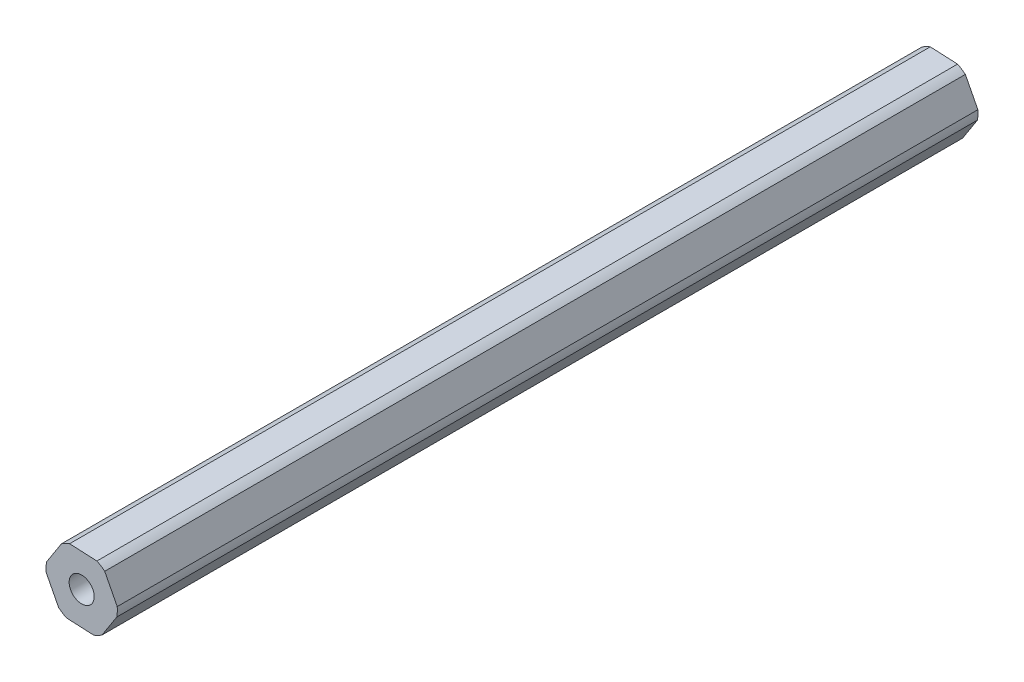
ISO-10303-21;
HEADER;
FILE_DESCRIPTION(('STEP AP214'),'2;1');
FILE_NAME('part.step','',(''),(''),'','','');
FILE_SCHEMA(('AUTOMOTIVE_DESIGN { 1 0 10303 214 1 1 1 1 }'));
ENDSEC;
DATA;
#1=APPLICATION_CONTEXT('core data for automotive mechanical design processes');
#2=APPLICATION_PROTOCOL_DEFINITION('international standard','automotive_design',2000,#1);
#3=PRODUCT_CONTEXT('',#1,'mechanical');
#4=PRODUCT('Part','Part','',(#3));
#5=PRODUCT_RELATED_PRODUCT_CATEGORY('part','',(#4));
#6=PRODUCT_DEFINITION_FORMATION('','',#4);
#7=PRODUCT_DEFINITION_CONTEXT('part definition',#1,'design');
#8=PRODUCT_DEFINITION('design','',#6,#7);
#9=PRODUCT_DEFINITION_SHAPE('','',#8);
#10=(LENGTH_UNIT() NAMED_UNIT(*) SI_UNIT(.MILLI.,.METRE.));
#11=(NAMED_UNIT(*) PLANE_ANGLE_UNIT() SI_UNIT($,.RADIAN.));
#12=(NAMED_UNIT(*) SI_UNIT($,.STERADIAN.) SOLID_ANGLE_UNIT());
#13=UNCERTAINTY_MEASURE_WITH_UNIT(LENGTH_MEASURE(1.E-05),#10,'distance_accuracy_value','');
#14=(GEOMETRIC_REPRESENTATION_CONTEXT(3) GLOBAL_UNCERTAINTY_ASSIGNED_CONTEXT((#13)) GLOBAL_UNIT_ASSIGNED_CONTEXT((#10,
#11,#12)) REPRESENTATION_CONTEXT('',''));
#15=CARTESIAN_POINT('',(0.,0.,0.));
#16=DIRECTION('',(0.,0.,1.));
#17=DIRECTION('',(1.,0.,0.));
#18=AXIS2_PLACEMENT_3D('',#15,#16,#17);
#19=CARTESIAN_POINT('',(-25.4,-1.E-12,-142.8115));
#20=DIRECTION('',(0.,0.,1.));
#21=DIRECTION('',(1.,0.,0.));
#22=AXIS2_PLACEMENT_3D('',#19,#20,#21);
#23=PLANE('',#22);
#24=CARTESIAN_POINT('',(-25.4,-1.E-12,-142.8115));
#25=DIRECTION('',(0.,0.,-1.));
#26=DIRECTION('',(-1.,0.,0.));
#27=AXIS2_PLACEMENT_3D('',#24,#25,#26);
#28=CIRCLE('',#27,2.413);
#29=CARTESIAN_POINT('',(-27.813,-1.E-12,-142.8115));
#30=VERTEX_POINT('',#29);
#31=EDGE_CURVE('E179',#30,#30,#28,.T.);
#32=ORIENTED_EDGE('',*,*,#31,.F.);
#33=EDGE_LOOP('',(#32));
#34=FACE_BOUND('',#33,.T.);
#35=CARTESIAN_POINT('',(-25.4,-1.E-12,-142.8115));
#36=DIRECTION('',(0.,0.,1.));
#37=DIRECTION('',(1.,0.,0.));
#38=AXIS2_PLACEMENT_3D('',#35,#36,#37);
#39=CIRCLE('',#38,6.875);
#40=CARTESIAN_POINT('',(-18.6339036084313,-1.21883740507216,-142.8115));
#41=VERTEX_POINT('',#40);
#42=CARTESIAN_POINT('',(-18.5482711692134,0.565187605460523,-142.8115));
#43=VERTEX_POINT('',#42);
#44=EDGE_CURVE('E164',#41,#43,#39,.T.);
#45=ORIENTED_EDGE('',*,*,#44,.F.);
#46=DIRECTION('',(0.540946049578257,0.841057293794946,0.));
#47=VECTOR('',#46,1.);
#48=CARTESIAN_POINT('',(-21.4846687603729,-5.65117742457372,-142.8115));
#49=LINE('',#48,#47);
#50=CARTESIAN_POINT('',(-21.4846687603729,-5.65117742457372,-142.8115));
#51=VERTEX_POINT('',#50);
#52=EDGE_CURVE('E217',#51,#41,#49,.T.);
#53=ORIENTED_EDGE('',*,*,#52,.F.);
#54=CARTESIAN_POINT('',(-25.4,-1.E-12,-142.8115));
#55=DIRECTION('',(0.,0.,1.));
#56=DIRECTION('',(1.,0.,0.));
#57=AXIS2_PLACEMENT_3D('',#54,#55,#56);
#58=CIRCLE('',#57,6.875);
#59=CARTESIAN_POINT('',(-23.0724959600899,-6.46903006208932,-142.8115));
#60=VERTEX_POINT('',#59);
#61=EDGE_CURVE('E213',#60,#51,#58,.T.);
#62=ORIENTED_EDGE('',*,*,#61,.F.);
#63=DIRECTION('',(0.998850007253744,-0.0479443741141371,0.));
#64=VECTOR('',#63,1.);
#65=CARTESIAN_POINT('',(-28.3363975911596,-6.21636503003521,-142.8115));
#66=LINE('',#65,#64);
#67=CARTESIAN_POINT('',(-28.3363975911596,-6.21636503003521,-142.8115));
#68=VERTEX_POINT('',#67);
#69=EDGE_CURVE('E209',#68,#60,#66,.T.);
#70=ORIENTED_EDGE('',*,*,#69,.F.);
#71=CARTESIAN_POINT('',(-25.4,-1.E-12,-142.8115));
#72=DIRECTION('',(0.,0.,1.));
#73=DIRECTION('',(1.,0.,0.));
#74=AXIS2_PLACEMENT_3D('',#71,#72,#73);
#75=CIRCLE('',#74,6.87499999999998);
#76=CARTESIAN_POINT('',(-29.8385923516587,-5.25019265701812,-142.8115));
#77=VERTEX_POINT('',#76);
#78=EDGE_CURVE('E205',#77,#68,#75,.T.);
#79=ORIENTED_EDGE('',*,*,#78,.F.);
#80=DIRECTION('',(0.457903957675487,-0.88900166790908,0.));
#81=VECTOR('',#80,1.);
#82=CARTESIAN_POINT('',(-32.2517288307866,-0.565187605462549,-142.8115));
#83=LINE('',#82,#81);
#84=CARTESIAN_POINT('',(-32.2517288307866,-0.565187605462549,-142.8115));
#85=VERTEX_POINT('',#84);
#86=EDGE_CURVE('E201',#85,#77,#83,.T.);
#87=ORIENTED_EDGE('',*,*,#86,.F.);
#88=CARTESIAN_POINT('',(-25.4,-1.E-12,-142.8115));
#89=DIRECTION('',(0.,0.,1.));
#90=DIRECTION('',(1.,0.,0.));
#91=AXIS2_PLACEMENT_3D('',#88,#89,#90);
#92=CIRCLE('',#91,6.87499999999999);
#93=CARTESIAN_POINT('',(-32.1660963915687,1.2188374050702,-142.8115));
#94=VERTEX_POINT('',#93);
#95=EDGE_CURVE('E197',#94,#85,#92,.T.);
#96=ORIENTED_EDGE('',*,*,#95,.F.);
#97=DIRECTION('',(-0.540946049578256,-0.841057293794946,0.));
#98=VECTOR('',#97,1.);
#99=CARTESIAN_POINT('',(-29.3153312396271,5.65117742457169,-142.8115));
#100=LINE('',#99,#98);
#101=CARTESIAN_POINT('',(-29.3153312396271,5.65117742457169,-142.8115));
#102=VERTEX_POINT('',#101);
#103=EDGE_CURVE('E193',#102,#94,#100,.T.);
#104=ORIENTED_EDGE('',*,*,#103,.F.);
#105=CARTESIAN_POINT('',(-25.4,-1.E-12,-142.8115));
#106=DIRECTION('',(0.,0.,1.));
#107=DIRECTION('',(1.,0.,0.));
#108=AXIS2_PLACEMENT_3D('',#105,#106,#107);
#109=CIRCLE('',#108,6.875);
#110=CARTESIAN_POINT('',(-27.72750403991,6.46903006208734,-142.8115));
#111=VERTEX_POINT('',#110);
#112=EDGE_CURVE('E189',#111,#102,#109,.T.);
#113=ORIENTED_EDGE('',*,*,#112,.F.);
#114=DIRECTION('',(-0.998850007253744,0.0479443741141365,0.));
#115=VECTOR('',#114,1.);
#116=CARTESIAN_POINT('',(-22.4636024088405,6.21636503003323,-142.8115));
#117=LINE('',#116,#115);
#118=CARTESIAN_POINT('',(-22.4636024088405,6.21636503003323,-142.8115));
#119=VERTEX_POINT('',#118);
#120=EDGE_CURVE('E185',#119,#111,#117,.T.);
#121=ORIENTED_EDGE('',*,*,#120,.F.);
#122=CARTESIAN_POINT('',(-25.4,-1.E-12,-142.8115));
#123=DIRECTION('',(0.,0.,1.));
#124=DIRECTION('',(1.,0.,0.));
#125=AXIS2_PLACEMENT_3D('',#122,#123,#124);
#126=CIRCLE('',#125,6.875);
#127=CARTESIAN_POINT('',(-20.9614076483413,5.25019265701615,-142.8115));
#128=VERTEX_POINT('',#127);
#129=EDGE_CURVE('E168',#128,#119,#126,.T.);
#130=ORIENTED_EDGE('',*,*,#129,.F.);
#131=DIRECTION('',(-0.457903957675487,0.88900166790908,0.));
#132=VECTOR('',#131,1.);
#133=CARTESIAN_POINT('',(-18.5482711692134,0.565187605460523,-142.8115));
#134=LINE('',#133,#132);
#135=EDGE_CURVE('E152',#43,#128,#134,.T.);
#136=ORIENTED_EDGE('',*,*,#135,.F.);
#137=EDGE_LOOP('',(#45,#53,#62,#70,#79,#87,#96,#104,#113,#121,#130,#136));
#138=FACE_BOUND('',#137,.T.);
#139=ADVANCED_FACE('F57',(#34,#138),#23,.F.);
#140=CARTESIAN_POINT('',(-25.4,-1.E-12,72.4535000000722));
#141=DIRECTION('',(0.,0.,-1.));
#142=DIRECTION('',(-0.457903957675486,0.88900166790908,0.));
#143=AXIS2_PLACEMENT_3D('',#140,#141,#142);
#144=CYLINDRICAL_SURFACE('',#143,6.875);
#145=CARTESIAN_POINT('',(-25.4,-1.E-12,23.0505));
#146=DIRECTION('',(0.,0.,-1.));
#147=DIRECTION('',(-1.,0.,0.));
#148=AXIS2_PLACEMENT_3D('',#145,#146,#147);
#149=CIRCLE('',#148,6.875);
#150=CARTESIAN_POINT('',(-20.9614076483413,5.25019265701615,23.0505));
#151=VERTEX_POINT('',#150);
#152=CARTESIAN_POINT('',(-22.4636024088405,6.21636503003324,23.0505));
#153=VERTEX_POINT('',#152);
#154=EDGE_CURVE('E238',#151,#153,#149,.F.);
#155=ORIENTED_EDGE('',*,*,#154,.F.);
#156=DIRECTION('',(0.,0.,-1.));
#157=VECTOR('',#156,1.);
#158=CARTESIAN_POINT('',(-20.9614076483413,5.25019265701615,72.4535000000722));
#159=LINE('',#158,#157);
#160=EDGE_CURVE('E158',#151,#128,#159,.T.);
#161=ORIENTED_EDGE('',*,*,#160,.T.);
#162=ORIENTED_EDGE('',*,*,#129,.T.);
#163=DIRECTION('',(0.,0.,1.));
#164=VECTOR('',#163,1.);
#165=CARTESIAN_POINT('',(-22.4636024088405,6.21636503003324,72.4535000000722));
#166=LINE('',#165,#164);
#167=EDGE_CURVE('E277',#119,#153,#166,.T.);
#168=ORIENTED_EDGE('',*,*,#167,.T.);
#169=EDGE_LOOP('',(#155,#161,#162,#168));
#170=FACE_BOUND('',#169,.T.);
#171=ADVANCED_FACE('F514',(#170),#144,.T.);
#172=CARTESIAN_POINT('',(-25.4,-1.E-12,72.4535000000722));
#173=DIRECTION('',(0.,0.,-1.));
#174=DIRECTION('',(-0.457903957675486,0.88900166790908,0.));
#175=AXIS2_PLACEMENT_3D('',#172,#173,#174);
#176=CYLINDRICAL_SURFACE('',#175,6.875);
#177=CARTESIAN_POINT('',(-25.4,-1.E-12,23.0505));
#178=DIRECTION('',(0.,0.,-1.));
#179=DIRECTION('',(-1.,0.,0.));
#180=AXIS2_PLACEMENT_3D('',#177,#178,#179);
#181=CIRCLE('',#180,6.875);
#182=CARTESIAN_POINT('',(-18.6339036084313,-1.21883740507216,23.0505));
#183=VERTEX_POINT('',#182);
#184=CARTESIAN_POINT('',(-18.5482711692134,0.565187605460525,23.0505));
#185=VERTEX_POINT('',#184);
#186=EDGE_CURVE('E249',#183,#185,#181,.F.);
#187=ORIENTED_EDGE('',*,*,#186,.F.);
#188=DIRECTION('',(0.,0.,-1.));
#189=VECTOR('',#188,1.);
#190=CARTESIAN_POINT('',(-18.6339036084313,-1.21883740507216,72.4535000000722));
#191=LINE('',#190,#189);
#192=EDGE_CURVE('E173',#183,#41,#191,.T.);
#193=ORIENTED_EDGE('',*,*,#192,.T.);
#194=ORIENTED_EDGE('',*,*,#44,.T.);
#195=DIRECTION('',(0.,0.,1.));
#196=VECTOR('',#195,1.);
#197=CARTESIAN_POINT('',(-18.5482711692134,0.565187605460524,72.4535000000722));
#198=LINE('',#197,#196);
#199=EDGE_CURVE('E148',#43,#185,#198,.T.);
#200=ORIENTED_EDGE('',*,*,#199,.T.);
#201=EDGE_LOOP('',(#187,#193,#194,#200));
#202=FACE_BOUND('',#201,.T.);
#203=ADVANCED_FACE('F171',(#202),#176,.T.);
#204=CARTESIAN_POINT('',(-25.4,-1.E-12,72.4535000000722));
#205=DIRECTION('',(0.,0.,-1.));
#206=DIRECTION('',(-0.457903957675486,0.88900166790908,0.));
#207=AXIS2_PLACEMENT_3D('',#204,#205,#206);
#208=CYLINDRICAL_SURFACE('',#207,6.875);
#209=CARTESIAN_POINT('',(-25.4,-1.E-12,23.0505));
#210=DIRECTION('',(0.,0.,-1.));
#211=DIRECTION('',(-1.,0.,0.));
#212=AXIS2_PLACEMENT_3D('',#209,#210,#211);
#213=CIRCLE('',#212,6.875);
#214=CARTESIAN_POINT('',(-32.1660963915687,1.2188374050702,23.0505));
#215=VERTEX_POINT('',#214);
#216=CARTESIAN_POINT('',(-32.2517288307866,-0.565187605462551,23.0505));
#217=VERTEX_POINT('',#216);
#218=EDGE_CURVE('E224',#215,#217,#213,.F.);
#219=ORIENTED_EDGE('',*,*,#218,.F.);
#220=DIRECTION('',(0.,0.,-1.));
#221=VECTOR('',#220,1.);
#222=CARTESIAN_POINT('',(-32.1660963915687,1.2188374050702,72.4535000000722));
#223=LINE('',#222,#221);
#224=EDGE_CURVE('E157',#215,#94,#223,.T.);
#225=ORIENTED_EDGE('',*,*,#224,.T.);
#226=ORIENTED_EDGE('',*,*,#95,.T.);
#227=DIRECTION('',(0.,0.,1.));
#228=VECTOR('',#227,1.);
#229=CARTESIAN_POINT('',(-32.2517288307866,-0.565187605462551,72.4535000000722));
#230=LINE('',#229,#228);
#231=EDGE_CURVE('E261',#85,#217,#230,.T.);
#232=ORIENTED_EDGE('',*,*,#231,.T.);
#233=EDGE_LOOP('',(#219,#225,#226,#232));
#234=FACE_BOUND('',#233,.T.);
#235=ADVANCED_FACE('F59',(#234),#208,.T.);
#236=CARTESIAN_POINT('',(-25.4,-1.E-12,72.4535000000722));
#237=DIRECTION('',(0.,0.,-1.));
#238=DIRECTION('',(-0.457903957675486,0.88900166790908,0.));
#239=AXIS2_PLACEMENT_3D('',#236,#237,#238);
#240=CYLINDRICAL_SURFACE('',#239,6.875);
#241=CARTESIAN_POINT('',(-25.4,-1.E-12,23.0505));
#242=DIRECTION('',(0.,0.,-1.));
#243=DIRECTION('',(-1.,0.,0.));
#244=AXIS2_PLACEMENT_3D('',#241,#242,#243);
#245=CIRCLE('',#244,6.875);
#246=CARTESIAN_POINT('',(-23.0724959600899,-6.46903006208932,23.0505));
#247=VERTEX_POINT('',#246);
#248=CARTESIAN_POINT('',(-21.4846687603729,-5.65117742457372,23.0505));
#249=VERTEX_POINT('',#248);
#250=EDGE_CURVE('E81',#247,#249,#245,.F.);
#251=ORIENTED_EDGE('',*,*,#250,.F.);
#252=DIRECTION('',(0.,0.,-1.));
#253=VECTOR('',#252,1.);
#254=CARTESIAN_POINT('',(-23.0724959600899,-6.46903006208932,72.4535000000722));
#255=LINE('',#254,#253);
#256=EDGE_CURVE('E61',#247,#60,#255,.T.);
#257=ORIENTED_EDGE('',*,*,#256,.T.);
#258=ORIENTED_EDGE('',*,*,#61,.T.);
#259=DIRECTION('',(0.,0.,1.));
#260=VECTOR('',#259,1.);
#261=CARTESIAN_POINT('',(-21.4846687603729,-5.65117742457372,72.4535000000722));
#262=LINE('',#261,#260);
#263=EDGE_CURVE('E262',#51,#249,#262,.T.);
#264=ORIENTED_EDGE('',*,*,#263,.T.);
#265=EDGE_LOOP('',(#251,#257,#258,#264));
#266=FACE_BOUND('',#265,.T.);
#267=ADVANCED_FACE('F365',(#266),#240,.T.);
#268=CARTESIAN_POINT('',(-25.4,-1.E-12,72.4535000000722));
#269=DIRECTION('',(0.,0.,-1.));
#270=DIRECTION('',(-0.457903957675486,0.88900166790908,0.));
#271=AXIS2_PLACEMENT_3D('',#268,#269,#270);
#272=CYLINDRICAL_SURFACE('',#271,6.875);
#273=CARTESIAN_POINT('',(-25.4,-1.E-12,23.0505));
#274=DIRECTION('',(0.,0.,-1.));
#275=DIRECTION('',(-1.,0.,0.));
#276=AXIS2_PLACEMENT_3D('',#273,#274,#275);
#277=CIRCLE('',#276,6.875);
#278=CARTESIAN_POINT('',(-29.8385923516587,-5.25019265701812,23.0505));
#279=VERTEX_POINT('',#278);
#280=CARTESIAN_POINT('',(-28.3363975911596,-6.21636503003522,23.0505));
#281=VERTEX_POINT('',#280);
#282=EDGE_CURVE('E235',#279,#281,#277,.F.);
#283=ORIENTED_EDGE('',*,*,#282,.F.);
#284=DIRECTION('',(0.,0.,-1.));
#285=VECTOR('',#284,1.);
#286=CARTESIAN_POINT('',(-29.8385923516587,-5.25019265701812,72.4535000000722));
#287=LINE('',#286,#285);
#288=EDGE_CURVE('E258',#279,#77,#287,.T.);
#289=ORIENTED_EDGE('',*,*,#288,.T.);
#290=ORIENTED_EDGE('',*,*,#78,.T.);
#291=DIRECTION('',(0.,0.,1.));
#292=VECTOR('',#291,1.);
#293=CARTESIAN_POINT('',(-28.3363975911596,-6.21636503003522,72.4535000000722));
#294=LINE('',#293,#292);
#295=EDGE_CURVE('E68',#68,#281,#294,.T.);
#296=ORIENTED_EDGE('',*,*,#295,.T.);
#297=EDGE_LOOP('',(#283,#289,#290,#296));
#298=FACE_BOUND('',#297,.T.);
#299=ADVANCED_FACE('F472',(#298),#272,.T.);
#300=CARTESIAN_POINT('',(-22.0424886400179,-6.51846997392313,-103.1875));
#301=DIRECTION('',(0.0479443741141347,0.998850007253744,0.));
#302=DIRECTION('',(0.,0.,1.));
#303=AXIS2_PLACEMENT_3D('',#300,#301,#302);
#304=PLANE('',#303);
#305=ORIENTED_EDGE('',*,*,#295,.F.);
#306=ORIENTED_EDGE('',*,*,#69,.T.);
#307=ORIENTED_EDGE('',*,*,#256,.F.);
#308=DIRECTION('',(-0.998850007253744,0.0479443741141346,0.));
#309=VECTOR('',#308,1.);
#310=CARTESIAN_POINT('',(-22.0424886400179,-6.51846997392313,23.0505));
#311=LINE('',#310,#309);
#312=EDGE_CURVE('E243',#247,#281,#311,.T.);
#313=ORIENTED_EDGE('',*,*,#312,.T.);
#314=EDGE_LOOP('',(#305,#306,#307,#313));
#315=FACE_BOUND('',#314,.T.);
#316=ADVANCED_FACE('F373',(#315),#304,.F.);
#317=CARTESIAN_POINT('',(-29.3664049112316,-6.16692511820139,-103.1875));
#318=DIRECTION('',(0.889001667909081,0.457903957675486,0.));
#319=DIRECTION('',(-0.457903957675486,0.889001667909081,0.));
#320=AXIS2_PLACEMENT_3D('',#317,#318,#319);
#321=PLANE('',#320);
#322=ORIENTED_EDGE('',*,*,#288,.F.);
#323=DIRECTION('',(-0.457903957675486,0.88900166790908,0.));
#324=VECTOR('',#323,1.);
#325=CARTESIAN_POINT('',(-29.3664049112316,-6.16692511820139,23.0505));
#326=LINE('',#325,#324);
#327=EDGE_CURVE('E231',#279,#217,#326,.T.);
#328=ORIENTED_EDGE('',*,*,#327,.T.);
#329=ORIENTED_EDGE('',*,*,#231,.F.);
#330=ORIENTED_EDGE('',*,*,#86,.T.);
#331=EDGE_LOOP('',(#322,#328,#329,#330));
#332=FACE_BOUND('',#331,.T.);
#333=ADVANCED_FACE('F450',(#332),#321,.F.);
#334=CARTESIAN_POINT('',(-18.0760837287863,-0.35154485572273,-103.1875));
#335=DIRECTION('',(-0.841057293794946,0.540946049578258,0.));
#336=DIRECTION('',(0.,0.,1.));
#337=AXIS2_PLACEMENT_3D('',#334,#335,#336);
#338=PLANE('',#337);
#339=ORIENTED_EDGE('',*,*,#263,.F.);
#340=ORIENTED_EDGE('',*,*,#52,.T.);
#341=ORIENTED_EDGE('',*,*,#192,.F.);
#342=DIRECTION('',(-0.540946049578258,-0.841057293794945,0.));
#343=VECTOR('',#342,1.);
#344=CARTESIAN_POINT('',(-18.0760837287863,-0.35154485572273,23.0505));
#345=LINE('',#344,#343);
#346=EDGE_CURVE('E76',#183,#249,#345,.T.);
#347=ORIENTED_EDGE('',*,*,#346,.T.);
#348=EDGE_LOOP('',(#339,#340,#341,#347));
#349=FACE_BOUND('',#348,.T.);
#350=ADVANCED_FACE('F369',(#349),#338,.F.);
#351=CARTESIAN_POINT('',(-32.7239162712137,0.351544855720738,-103.1875));
#352=DIRECTION('',(0.841057293794946,-0.540946049578258,0.));
#353=DIRECTION('',(0.,0.,-1.));
#354=AXIS2_PLACEMENT_3D('',#351,#352,#353);
#355=PLANE('',#354);
#356=ORIENTED_EDGE('',*,*,#224,.F.);
#357=DIRECTION('',(0.540946049578258,0.841057293794945,0.));
#358=VECTOR('',#357,1.);
#359=CARTESIAN_POINT('',(-32.7239162712137,0.351544855720738,23.0505));
#360=LINE('',#359,#358);
#361=CARTESIAN_POINT('',(-29.3153312396271,5.65117742457169,23.0505));
#362=VERTEX_POINT('',#361);
#363=EDGE_CURVE('E220',#215,#362,#360,.T.);
#364=ORIENTED_EDGE('',*,*,#363,.T.);
#365=DIRECTION('',(0.,0.,1.));
#366=VECTOR('',#365,1.);
#367=CARTESIAN_POINT('',(-29.3153312396271,5.65117742457169,72.4535000000722));
#368=LINE('',#367,#366);
#369=EDGE_CURVE('E254',#102,#362,#368,.T.);
#370=ORIENTED_EDGE('',*,*,#369,.F.);
#371=ORIENTED_EDGE('',*,*,#103,.T.);
#372=EDGE_LOOP('',(#356,#364,#370,#371));
#373=FACE_BOUND('',#372,.T.);
#374=ADVANCED_FACE('F345',(#373),#355,.F.);
#375=CARTESIAN_POINT('',(-21.4335950887684,6.16692511819942,-103.1875));
#376=DIRECTION('',(-0.88900166790908,-0.457903957675486,0.));
#377=DIRECTION('',(0.457903957675486,-0.88900166790908,0.));
#378=AXIS2_PLACEMENT_3D('',#375,#376,#377);
#379=PLANE('',#378);
#380=ORIENTED_EDGE('',*,*,#199,.F.);
#381=ORIENTED_EDGE('',*,*,#135,.T.);
#382=ORIENTED_EDGE('',*,*,#160,.F.);
#383=DIRECTION('',(0.457903957675486,-0.88900166790908,0.));
#384=VECTOR('',#383,1.);
#385=CARTESIAN_POINT('',(-21.4335950887684,6.16692511819942,23.0505));
#386=LINE('',#385,#384);
#387=EDGE_CURVE('E153',#151,#185,#386,.T.);
#388=ORIENTED_EDGE('',*,*,#387,.T.);
#389=EDGE_LOOP('',(#380,#381,#382,#388));
#390=FACE_BOUND('',#389,.T.);
#391=ADVANCED_FACE('F150',(#390),#379,.F.);
#392=CARTESIAN_POINT('',(-28.7575113599821,6.51846997392115,-103.1875));
#393=DIRECTION('',(-0.0479443741141347,-0.998850007253744,0.));
#394=DIRECTION('',(0.998850007253744,-0.0479443741141347,0.));
#395=AXIS2_PLACEMENT_3D('',#392,#393,#394);
#396=PLANE('',#395);
#397=ORIENTED_EDGE('',*,*,#167,.F.);
#398=ORIENTED_EDGE('',*,*,#120,.T.);
#399=DIRECTION('',(0.,0.,-1.));
#400=VECTOR('',#399,1.);
#401=CARTESIAN_POINT('',(-27.72750403991,6.46903006208734,72.4535000000722));
#402=LINE('',#401,#400);
#403=CARTESIAN_POINT('',(-27.72750403991,6.46903006208734,23.0505));
#404=VERTEX_POINT('',#403);
#405=EDGE_CURVE('E326',#404,#111,#402,.T.);
#406=ORIENTED_EDGE('',*,*,#405,.F.);
#407=DIRECTION('',(0.998850007253744,-0.0479443741141346,0.));
#408=VECTOR('',#407,1.);
#409=CARTESIAN_POINT('',(-28.7575113599821,6.51846997392115,23.0505));
#410=LINE('',#409,#408);
#411=EDGE_CURVE('E227',#404,#153,#410,.T.);
#412=ORIENTED_EDGE('',*,*,#411,.T.);
#413=EDGE_LOOP('',(#397,#398,#406,#412));
#414=FACE_BOUND('',#413,.T.);
#415=ADVANCED_FACE('F393',(#414),#396,.F.);
#416=CARTESIAN_POINT('',(-25.4,-1.E-12,72.4535000000722));
#417=DIRECTION('',(0.,0.,-1.));
#418=DIRECTION('',(-0.457903957675486,0.88900166790908,0.));
#419=AXIS2_PLACEMENT_3D('',#416,#417,#418);
#420=CYLINDRICAL_SURFACE('',#419,6.875);
#421=CARTESIAN_POINT('',(-25.4,-1.E-12,23.0505));
#422=DIRECTION('',(0.,0.,-1.));
#423=DIRECTION('',(-1.,0.,0.));
#424=AXIS2_PLACEMENT_3D('',#421,#422,#423);
#425=CIRCLE('',#424,6.875);
#426=EDGE_CURVE('E13',#404,#362,#425,.F.);
#427=ORIENTED_EDGE('',*,*,#426,.F.);
#428=ORIENTED_EDGE('',*,*,#405,.T.);
#429=ORIENTED_EDGE('',*,*,#112,.T.);
#430=ORIENTED_EDGE('',*,*,#369,.T.);
#431=EDGE_LOOP('',(#427,#428,#429,#430));
#432=FACE_BOUND('',#431,.T.);
#433=ADVANCED_FACE('F340',(#432),#420,.T.);
#434=CARTESIAN_POINT('',(-25.4,-1.E-12,23.0505));
#435=DIRECTION('',(0.,0.,-1.));
#436=DIRECTION('',(-0.457903957675486,0.88900166790908,0.));
#437=AXIS2_PLACEMENT_3D('',#434,#435,#436);
#438=PLANE('',#437);
#439=CARTESIAN_POINT('',(-25.4,-1.E-12,23.0505));
#440=DIRECTION('',(0.,0.,-1.));
#441=DIRECTION('',(-1.,0.,0.));
#442=AXIS2_PLACEMENT_3D('',#439,#440,#441);
#443=CIRCLE('',#442,2.413);
#444=CARTESIAN_POINT('',(-27.813,-1.E-12,23.0505));
#445=VERTEX_POINT('',#444);
#446=EDGE_CURVE('E175',#445,#445,#443,.T.);
#447=ORIENTED_EDGE('',*,*,#446,.T.);
#448=EDGE_LOOP('',(#447));
#449=FACE_BOUND('',#448,.T.);
#450=ORIENTED_EDGE('',*,*,#186,.T.);
#451=ORIENTED_EDGE('',*,*,#387,.F.);
#452=ORIENTED_EDGE('',*,*,#154,.T.);
#453=ORIENTED_EDGE('',*,*,#411,.F.);
#454=ORIENTED_EDGE('',*,*,#426,.T.);
#455=ORIENTED_EDGE('',*,*,#363,.F.);
#456=ORIENTED_EDGE('',*,*,#218,.T.);
#457=ORIENTED_EDGE('',*,*,#327,.F.);
#458=ORIENTED_EDGE('',*,*,#282,.T.);
#459=ORIENTED_EDGE('',*,*,#312,.F.);
#460=ORIENTED_EDGE('',*,*,#250,.T.);
#461=ORIENTED_EDGE('',*,*,#346,.F.);
#462=EDGE_LOOP('',(#450,#451,#452,#453,#454,#455,#456,#457,#458,#459,#460,#461));
#463=FACE_BOUND('',#462,.T.);
#464=ADVANCED_FACE('F347',(#449,#463),#438,.F.);
#465=CARTESIAN_POINT('',(-25.4,-1.E-12,23.0505));
#466=DIRECTION('',(0.,0.,-1.));
#467=DIRECTION('',(-1.,0.,0.));
#468=AXIS2_PLACEMENT_3D('',#465,#466,#467);
#469=CYLINDRICAL_SURFACE('',#468,2.413);
#470=ORIENTED_EDGE('',*,*,#446,.F.);
#471=EDGE_LOOP('',(#470));
#472=FACE_BOUND('',#471,.T.);
#473=ORIENTED_EDGE('',*,*,#31,.T.);
#474=EDGE_LOOP('',(#473));
#475=FACE_BOUND('',#474,.T.);
#476=ADVANCED_FACE('F543',(#472,#475),#469,.F.);
#477=CLOSED_SHELL('',(#139,#171,#203,#235,#267,#299,#316,#333,#350,#374,#391,#415,#433,#464,#476));
#478=MANIFOLD_SOLID_BREP('B2',#477);
#479=ADVANCED_BREP_SHAPE_REPRESENTATION('',(#18,#478),#14);
#480=SHAPE_DEFINITION_REPRESENTATION(#9,#479);
ENDSEC;
END-ISO-10303-21;
